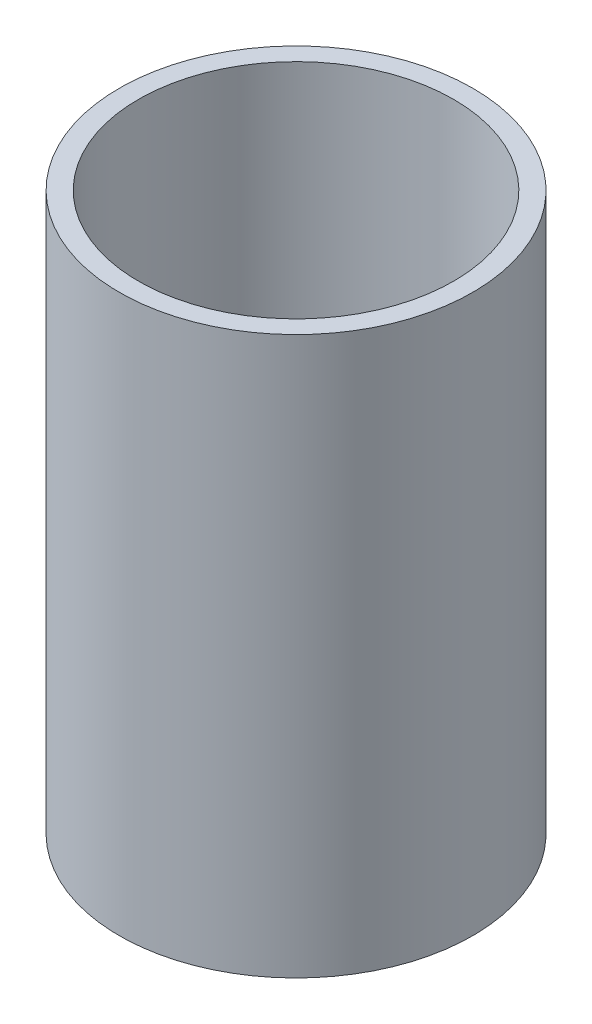
ISO-10303-21;
HEADER;
FILE_DESCRIPTION(('STEP AP214'),'2;1');
FILE_NAME('part.step','',(''),(''),'','','');
FILE_SCHEMA(('AUTOMOTIVE_DESIGN { 1 0 10303 214 1 1 1 1 }'));
ENDSEC;
DATA;
#1=APPLICATION_CONTEXT('core data for automotive mechanical design processes');
#2=APPLICATION_PROTOCOL_DEFINITION('international standard','automotive_design',2000,#1);
#3=PRODUCT_CONTEXT('',#1,'mechanical');
#4=PRODUCT('Part','Part','',(#3));
#5=PRODUCT_RELATED_PRODUCT_CATEGORY('part','',(#4));
#6=PRODUCT_DEFINITION_FORMATION('','',#4);
#7=PRODUCT_DEFINITION_CONTEXT('part definition',#1,'design');
#8=PRODUCT_DEFINITION('design','',#6,#7);
#9=PRODUCT_DEFINITION_SHAPE('','',#8);
#10=(LENGTH_UNIT() NAMED_UNIT(*) SI_UNIT(.MILLI.,.METRE.));
#11=(NAMED_UNIT(*) PLANE_ANGLE_UNIT() SI_UNIT($,.RADIAN.));
#12=(NAMED_UNIT(*) SI_UNIT($,.STERADIAN.) SOLID_ANGLE_UNIT());
#13=UNCERTAINTY_MEASURE_WITH_UNIT(LENGTH_MEASURE(1.E-05),#10,'distance_accuracy_value','');
#14=(GEOMETRIC_REPRESENTATION_CONTEXT(3) GLOBAL_UNCERTAINTY_ASSIGNED_CONTEXT((#13)) GLOBAL_UNIT_ASSIGNED_CONTEXT((#10,
#11,#12)) REPRESENTATION_CONTEXT('',''));
#15=CARTESIAN_POINT('',(0.,0.,0.));
#16=DIRECTION('',(0.,0.,1.));
#17=DIRECTION('',(1.,0.,0.));
#18=AXIS2_PLACEMENT_3D('',#15,#16,#17);
#19=CARTESIAN_POINT('',(0.,7.25,0.));
#20=DIRECTION('',(0.,1.,0.));
#21=DIRECTION('',(0.,0.,1.));
#22=AXIS2_PLACEMENT_3D('',#19,#20,#21);
#23=PLANE('',#22);
#24=CARTESIAN_POINT('',(0.,7.25,0.));
#25=DIRECTION('',(0.,1.,0.));
#26=DIRECTION('',(0.,0.,1.));
#27=AXIS2_PLACEMENT_3D('',#24,#25,#26);
#28=CIRCLE('',#27,4.6);
#29=CARTESIAN_POINT('',(0.,7.25,-4.6));
#30=VERTEX_POINT('',#29);
#31=EDGE_CURVE('E10',#30,#30,#28,.T.);
#32=ORIENTED_EDGE('',*,*,#31,.T.);
#33=EDGE_LOOP('',(#32));
#34=FACE_BOUND('',#33,.T.);
#35=CARTESIAN_POINT('',(0.,7.25,0.));
#36=DIRECTION('',(0.,1.,0.));
#37=DIRECTION('',(0.,0.,1.));
#38=AXIS2_PLACEMENT_3D('',#35,#36,#37);
#39=CIRCLE('',#38,4.1);
#40=CARTESIAN_POINT('',(0.,7.25,-4.1));
#41=VERTEX_POINT('',#40);
#42=EDGE_CURVE('E49',#41,#41,#39,.T.);
#43=ORIENTED_EDGE('',*,*,#42,.F.);
#44=EDGE_LOOP('',(#43));
#45=FACE_BOUND('',#44,.T.);
#46=ADVANCED_FACE('F35',(#34,#45),#23,.T.);
#47=CARTESIAN_POINT('',(0.,-7.25,0.));
#48=DIRECTION('',(0.,1.,0.));
#49=DIRECTION('',(0.,0.,1.));
#50=AXIS2_PLACEMENT_3D('',#47,#48,#49);
#51=PLANE('',#50);
#52=CARTESIAN_POINT('',(0.,-7.25,0.));
#53=DIRECTION('',(0.,1.,0.));
#54=DIRECTION('',(0.,0.,1.));
#55=AXIS2_PLACEMENT_3D('',#52,#53,#54);
#56=CIRCLE('',#55,4.6);
#57=CARTESIAN_POINT('',(0.,-7.25,-4.6));
#58=VERTEX_POINT('',#57);
#59=EDGE_CURVE('E39',#58,#58,#56,.T.);
#60=ORIENTED_EDGE('',*,*,#59,.F.);
#61=EDGE_LOOP('',(#60));
#62=FACE_BOUND('',#61,.T.);
#63=CARTESIAN_POINT('',(0.,-7.25,0.));
#64=DIRECTION('',(0.,1.,0.));
#65=DIRECTION('',(0.,0.,1.));
#66=AXIS2_PLACEMENT_3D('',#63,#64,#65);
#67=CIRCLE('',#66,4.1);
#68=CARTESIAN_POINT('',(0.,-7.25,-4.1));
#69=VERTEX_POINT('',#68);
#70=EDGE_CURVE('E51',#69,#69,#67,.T.);
#71=ORIENTED_EDGE('',*,*,#70,.T.);
#72=EDGE_LOOP('',(#71));
#73=FACE_BOUND('',#72,.T.);
#74=ADVANCED_FACE('F62',(#62,#73),#51,.F.);
#75=CARTESIAN_POINT('',(0.,7.25,0.));
#76=DIRECTION('',(0.,-1.,0.));
#77=DIRECTION('',(0.,0.,-1.));
#78=AXIS2_PLACEMENT_3D('',#75,#76,#77);
#79=CYLINDRICAL_SURFACE('',#78,4.6);
#80=CARTESIAN_POINT('',(0.,7.25,-4.6));
#81=CARTESIAN_POINT('',(0.,7.09895833333333,-4.6));
#82=CARTESIAN_POINT('',(0.,6.94791666666667,-4.6));
#83=CARTESIAN_POINT('',(0.,6.64583333333333,-4.6));
#84=CARTESIAN_POINT('',(0.,6.49479166666667,-4.6));
#85=CARTESIAN_POINT('',(0.,6.19270833333333,-4.6));
#86=CARTESIAN_POINT('',(0.,6.04166666666667,-4.6));
#87=CARTESIAN_POINT('',(0.,5.73958333333333,-4.6));
#88=CARTESIAN_POINT('',(0.,5.58854166666667,-4.6));
#89=CARTESIAN_POINT('',(0.,5.28645833333333,-4.6));
#90=CARTESIAN_POINT('',(0.,5.13541666666667,-4.6));
#91=CARTESIAN_POINT('',(0.,4.83333333333333,-4.6));
#92=CARTESIAN_POINT('',(0.,4.68229166666667,-4.6));
#93=CARTESIAN_POINT('',(0.,4.38020833333333,-4.6));
#94=CARTESIAN_POINT('',(0.,4.22916666666667,-4.6));
#95=CARTESIAN_POINT('',(0.,3.92708333333333,-4.6));
#96=CARTESIAN_POINT('',(0.,3.77604166666667,-4.6));
#97=CARTESIAN_POINT('',(0.,3.47395833333333,-4.6));
#98=CARTESIAN_POINT('',(0.,3.32291666666667,-4.6));
#99=CARTESIAN_POINT('',(0.,3.02083333333333,-4.6));
#100=CARTESIAN_POINT('',(0.,2.86979166666667,-4.6));
#101=CARTESIAN_POINT('',(0.,2.56770833333333,-4.6));
#102=CARTESIAN_POINT('',(0.,2.41666666666667,-4.6));
#103=CARTESIAN_POINT('',(0.,2.11458333333333,-4.6));
#104=CARTESIAN_POINT('',(0.,1.96354166666667,-4.6));
#105=CARTESIAN_POINT('',(0.,1.66145833333333,-4.6));
#106=CARTESIAN_POINT('',(0.,1.51041666666667,-4.6));
#107=CARTESIAN_POINT('',(0.,1.20833333333333,-4.6));
#108=CARTESIAN_POINT('',(0.,1.05729166666667,-4.6));
#109=CARTESIAN_POINT('',(0.,0.755208333333333,-4.6));
#110=CARTESIAN_POINT('',(0.,0.604166666666667,-4.6));
#111=CARTESIAN_POINT('',(0.,0.302083333333334,-4.6));
#112=CARTESIAN_POINT('',(0.,0.151041666666667,-4.6));
#113=CARTESIAN_POINT('',(0.,-0.151041666666667,-4.6));
#114=CARTESIAN_POINT('',(0.,-0.302083333333334,-4.6));
#115=CARTESIAN_POINT('',(0.,-0.604166666666667,-4.6));
#116=CARTESIAN_POINT('',(0.,-0.755208333333333,-4.6));
#117=CARTESIAN_POINT('',(0.,-1.05729166666667,-4.6));
#118=CARTESIAN_POINT('',(0.,-1.20833333333333,-4.6));
#119=CARTESIAN_POINT('',(0.,-1.51041666666667,-4.6));
#120=CARTESIAN_POINT('',(0.,-1.66145833333333,-4.6));
#121=CARTESIAN_POINT('',(0.,-1.96354166666667,-4.6));
#122=CARTESIAN_POINT('',(0.,-2.11458333333333,-4.6));
#123=CARTESIAN_POINT('',(0.,-2.41666666666667,-4.6));
#124=CARTESIAN_POINT('',(0.,-2.56770833333333,-4.6));
#125=CARTESIAN_POINT('',(0.,-2.86979166666667,-4.6));
#126=CARTESIAN_POINT('',(0.,-3.02083333333333,-4.6));
#127=CARTESIAN_POINT('',(0.,-3.32291666666667,-4.6));
#128=CARTESIAN_POINT('',(0.,-3.47395833333333,-4.6));
#129=CARTESIAN_POINT('',(0.,-3.77604166666667,-4.6));
#130=CARTESIAN_POINT('',(0.,-3.92708333333333,-4.6));
#131=CARTESIAN_POINT('',(0.,-4.22916666666667,-4.6));
#132=CARTESIAN_POINT('',(0.,-4.38020833333333,-4.6));
#133=CARTESIAN_POINT('',(0.,-4.68229166666667,-4.6));
#134=CARTESIAN_POINT('',(0.,-4.83333333333333,-4.6));
#135=CARTESIAN_POINT('',(0.,-5.13541666666667,-4.6));
#136=CARTESIAN_POINT('',(0.,-5.28645833333333,-4.6));
#137=CARTESIAN_POINT('',(0.,-5.58854166666667,-4.6));
#138=CARTESIAN_POINT('',(0.,-5.73958333333333,-4.6));
#139=CARTESIAN_POINT('',(0.,-6.04166666666667,-4.6));
#140=CARTESIAN_POINT('',(0.,-6.19270833333333,-4.6));
#141=CARTESIAN_POINT('',(0.,-6.49479166666667,-4.6));
#142=CARTESIAN_POINT('',(0.,-6.64583333333333,-4.6));
#143=CARTESIAN_POINT('',(0.,-6.94791666666667,-4.6));
#144=CARTESIAN_POINT('',(0.,-7.09895833333333,-4.6));
#145=CARTESIAN_POINT('',(0.,-7.25,-4.6));
#146=B_SPLINE_CURVE_WITH_KNOTS('',3,(#80,#81,#82,#83,#84,#85,#86,#87,#88,#89,#90,#91,#92,#93,
#94,#95,#96,#97,#98,#99,#100,#101,#102,#103,#104,#105,#106,#107,#108,#109,#110,#111,#112,#113,
#114,#115,#116,#117,#118,#119,#120,#121,#122,#123,#124,#125,#126,#127,#128,#129,#130,#131,#132,
#133,#134,#135,#136,#137,#138,#139,#140,#141,#142,#143,#144,#145),.UNSPECIFIED.,.F.,.F.,(4,2,2,
2,2,2,2,2,2,2,2,2,2,2,2,2,2,2,2,2,2,2,2,2,2,2,2,2,2,2,2,2,4),(0.,0.453125,0.906250000000001,
1.359375,1.8125,2.265625,2.71875,3.171875,3.625,4.078125,4.53125,4.984375,5.4375,5.890625,
6.34375,6.796875,7.25,7.703125,8.15625,8.609375,9.0625,9.515625,9.96875,10.421875,10.875,
11.328125,11.78125,12.234375,12.6875,13.140625,13.59375,14.046875,14.5),.UNSPECIFIED.);
#147=EDGE_CURVE('BSEAM37',#30,#58,#146,.T.);
#148=ORIENTED_EDGE('',*,*,#31,.F.);
#149=ORIENTED_EDGE('',*,*,#59,.T.);
#150=ORIENTED_EDGE('',*,*,#147,.T.);
#151=ORIENTED_EDGE('',*,*,#147,.F.);
#152=EDGE_LOOP('',(#148,#150,#149,#151));
#153=FACE_BOUND('',#152,.T.);
#154=ADVANCED_FACE('F37',(#153),#79,.T.);
#155=CARTESIAN_POINT('',(0.,7.25,0.));
#156=DIRECTION('',(0.,-1.,0.));
#157=DIRECTION('',(0.,0.,-1.));
#158=AXIS2_PLACEMENT_3D('',#155,#156,#157);
#159=CYLINDRICAL_SURFACE('',#158,4.1);
#160=CARTESIAN_POINT('',(0.,7.25,-4.1));
#161=CARTESIAN_POINT('',(0.,7.09895833333333,-4.1));
#162=CARTESIAN_POINT('',(0.,6.94791666666667,-4.1));
#163=CARTESIAN_POINT('',(0.,6.64583333333333,-4.1));
#164=CARTESIAN_POINT('',(0.,6.49479166666667,-4.1));
#165=CARTESIAN_POINT('',(0.,6.19270833333333,-4.1));
#166=CARTESIAN_POINT('',(0.,6.04166666666667,-4.1));
#167=CARTESIAN_POINT('',(0.,5.73958333333333,-4.1));
#168=CARTESIAN_POINT('',(0.,5.58854166666667,-4.1));
#169=CARTESIAN_POINT('',(0.,5.28645833333333,-4.1));
#170=CARTESIAN_POINT('',(0.,5.13541666666667,-4.1));
#171=CARTESIAN_POINT('',(0.,4.83333333333333,-4.1));
#172=CARTESIAN_POINT('',(0.,4.68229166666667,-4.1));
#173=CARTESIAN_POINT('',(0.,4.38020833333333,-4.1));
#174=CARTESIAN_POINT('',(0.,4.22916666666667,-4.1));
#175=CARTESIAN_POINT('',(0.,3.92708333333333,-4.1));
#176=CARTESIAN_POINT('',(0.,3.77604166666667,-4.1));
#177=CARTESIAN_POINT('',(0.,3.47395833333333,-4.1));
#178=CARTESIAN_POINT('',(0.,3.32291666666667,-4.1));
#179=CARTESIAN_POINT('',(0.,3.02083333333333,-4.1));
#180=CARTESIAN_POINT('',(0.,2.86979166666667,-4.1));
#181=CARTESIAN_POINT('',(0.,2.56770833333333,-4.1));
#182=CARTESIAN_POINT('',(0.,2.41666666666667,-4.1));
#183=CARTESIAN_POINT('',(0.,2.11458333333333,-4.1));
#184=CARTESIAN_POINT('',(0.,1.96354166666667,-4.1));
#185=CARTESIAN_POINT('',(0.,1.66145833333333,-4.1));
#186=CARTESIAN_POINT('',(0.,1.51041666666667,-4.1));
#187=CARTESIAN_POINT('',(0.,1.20833333333333,-4.1));
#188=CARTESIAN_POINT('',(0.,1.05729166666667,-4.1));
#189=CARTESIAN_POINT('',(0.,0.755208333333333,-4.1));
#190=CARTESIAN_POINT('',(0.,0.604166666666666,-4.1));
#191=CARTESIAN_POINT('',(0.,0.302083333333333,-4.1));
#192=CARTESIAN_POINT('',(0.,0.151041666666666,-4.1));
#193=CARTESIAN_POINT('',(0.,-0.151041666666668,-4.1));
#194=CARTESIAN_POINT('',(0.,-0.302083333333334,-4.1));
#195=CARTESIAN_POINT('',(0.,-0.604166666666667,-4.1));
#196=CARTESIAN_POINT('',(0.,-0.755208333333334,-4.1));
#197=CARTESIAN_POINT('',(0.,-1.05729166666667,-4.1));
#198=CARTESIAN_POINT('',(0.,-1.20833333333333,-4.1));
#199=CARTESIAN_POINT('',(0.,-1.51041666666667,-4.1));
#200=CARTESIAN_POINT('',(0.,-1.66145833333333,-4.1));
#201=CARTESIAN_POINT('',(0.,-1.96354166666667,-4.1));
#202=CARTESIAN_POINT('',(0.,-2.11458333333333,-4.1));
#203=CARTESIAN_POINT('',(0.,-2.41666666666667,-4.1));
#204=CARTESIAN_POINT('',(0.,-2.56770833333333,-4.1));
#205=CARTESIAN_POINT('',(0.,-2.86979166666667,-4.1));
#206=CARTESIAN_POINT('',(0.,-3.02083333333333,-4.1));
#207=CARTESIAN_POINT('',(0.,-3.32291666666667,-4.1));
#208=CARTESIAN_POINT('',(0.,-3.47395833333333,-4.1));
#209=CARTESIAN_POINT('',(0.,-3.77604166666667,-4.1));
#210=CARTESIAN_POINT('',(0.,-3.92708333333333,-4.1));
#211=CARTESIAN_POINT('',(0.,-4.22916666666667,-4.1));
#212=CARTESIAN_POINT('',(0.,-4.38020833333333,-4.1));
#213=CARTESIAN_POINT('',(0.,-4.68229166666667,-4.1));
#214=CARTESIAN_POINT('',(0.,-4.83333333333333,-4.1));
#215=CARTESIAN_POINT('',(0.,-5.13541666666667,-4.1));
#216=CARTESIAN_POINT('',(0.,-5.28645833333333,-4.1));
#217=CARTESIAN_POINT('',(0.,-5.58854166666667,-4.1));
#218=CARTESIAN_POINT('',(0.,-5.73958333333333,-4.1));
#219=CARTESIAN_POINT('',(0.,-6.04166666666667,-4.1));
#220=CARTESIAN_POINT('',(0.,-6.19270833333333,-4.1));
#221=CARTESIAN_POINT('',(0.,-6.49479166666667,-4.1));
#222=CARTESIAN_POINT('',(0.,-6.64583333333333,-4.1));
#223=CARTESIAN_POINT('',(0.,-6.94791666666667,-4.1));
#224=CARTESIAN_POINT('',(0.,-7.09895833333333,-4.1));
#225=CARTESIAN_POINT('',(0.,-7.25,-4.1));
#226=B_SPLINE_CURVE_WITH_KNOTS('',3,(#160,#161,#162,#163,#164,#165,#166,#167,#168,#169,#170,
#171,#172,#173,#174,#175,#176,#177,#178,#179,#180,#181,#182,#183,#184,#185,#186,#187,#188,#189,
#190,#191,#192,#193,#194,#195,#196,#197,#198,#199,#200,#201,#202,#203,#204,#205,#206,#207,#208,
#209,#210,#211,#212,#213,#214,#215,#216,#217,#218,#219,#220,#221,#222,#223,#224,#225),
.UNSPECIFIED.,.F.,.F.,(4,2,2,2,2,2,2,2,2,2,2,2,2,2,2,2,2,2,2,2,2,2,2,2,2,2,2,2,2,2,2,2,4),(0.,
0.453125,0.90625,1.359375,1.8125,2.265625,2.71875,3.171875,3.625,4.078125,4.53125,4.984375,
5.4375,5.890625,6.34375,6.796875,7.25,7.703125,8.15625,8.609375,9.0625,9.515625,9.96875,
10.421875,10.875,11.328125,11.78125,12.234375,12.6875,13.140625,13.59375,14.046875,14.5),.UNSPECIFIED.);
#227=EDGE_CURVE('BSEAM58',#41,#69,#226,.T.);
#228=ORIENTED_EDGE('',*,*,#42,.T.);
#229=ORIENTED_EDGE('',*,*,#70,.F.);
#230=ORIENTED_EDGE('',*,*,#227,.T.);
#231=ORIENTED_EDGE('',*,*,#227,.F.);
#232=EDGE_LOOP('',(#228,#230,#229,#231));
#233=FACE_BOUND('',#232,.T.);
#234=ADVANCED_FACE('F58',(#233),#159,.F.);
#235=CLOSED_SHELL('',(#46,#74,#154,#234));
#236=MANIFOLD_SOLID_BREP('B2',#235);
#237=ADVANCED_BREP_SHAPE_REPRESENTATION('',(#18,#236),#14);
#238=SHAPE_DEFINITION_REPRESENTATION(#9,#237);
ENDSEC;
END-ISO-10303-21;
